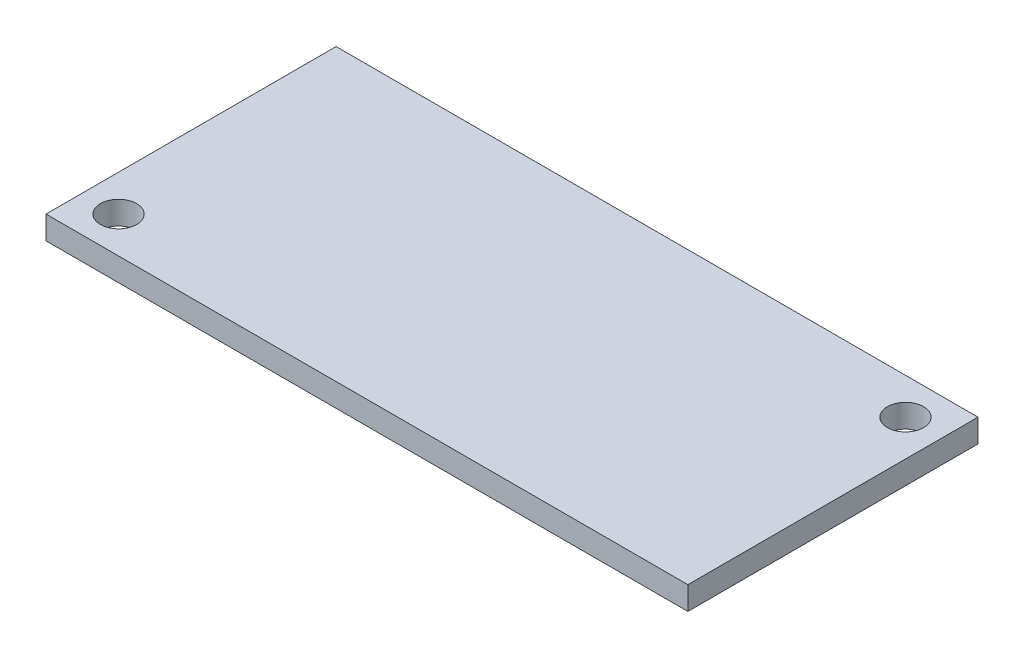
ISO-10303-21;
HEADER;
FILE_DESCRIPTION(('STEP AP214'),'2;1');
FILE_NAME('part.step','',(''),(''),'','','');
FILE_SCHEMA(('AUTOMOTIVE_DESIGN { 1 0 10303 214 1 1 1 1 }'));
ENDSEC;
DATA;
#1=APPLICATION_CONTEXT('core data for automotive mechanical design processes');
#2=APPLICATION_PROTOCOL_DEFINITION('international standard','automotive_design',2000,#1);
#3=PRODUCT_CONTEXT('',#1,'mechanical');
#4=PRODUCT('Part','Part','',(#3));
#5=PRODUCT_RELATED_PRODUCT_CATEGORY('part','',(#4));
#6=PRODUCT_DEFINITION_FORMATION('','',#4);
#7=PRODUCT_DEFINITION_CONTEXT('part definition',#1,'design');
#8=PRODUCT_DEFINITION('design','',#6,#7);
#9=PRODUCT_DEFINITION_SHAPE('','',#8);
#10=(LENGTH_UNIT() NAMED_UNIT(*) SI_UNIT(.MILLI.,.METRE.));
#11=(NAMED_UNIT(*) PLANE_ANGLE_UNIT() SI_UNIT($,.RADIAN.));
#12=(NAMED_UNIT(*) SI_UNIT($,.STERADIAN.) SOLID_ANGLE_UNIT());
#13=UNCERTAINTY_MEASURE_WITH_UNIT(LENGTH_MEASURE(1.E-05),#10,'distance_accuracy_value','');
#14=(GEOMETRIC_REPRESENTATION_CONTEXT(3) GLOBAL_UNCERTAINTY_ASSIGNED_CONTEXT((#13)) GLOBAL_UNIT_ASSIGNED_CONTEXT((#10,
#11,#12)) REPRESENTATION_CONTEXT('',''));
#15=CARTESIAN_POINT('',(0.,0.,0.));
#16=DIRECTION('',(0.,0.,1.));
#17=DIRECTION('',(1.,0.,0.));
#18=AXIS2_PLACEMENT_3D('',#15,#16,#17);
#19=CARTESIAN_POINT('',(22.125,1.6,10.));
#20=DIRECTION('',(-1.,0.,0.));
#21=DIRECTION('',(0.,0.,1.));
#22=AXIS2_PLACEMENT_3D('',#19,#20,#21);
#23=PLANE('',#22);
#24=DIRECTION('',(0.,0.,-1.));
#25=VECTOR('',#24,1.);
#26=CARTESIAN_POINT('',(22.125,0.,10.));
#27=LINE('',#26,#25);
#28=CARTESIAN_POINT('',(22.125,0.,10.));
#29=VERTEX_POINT('',#28);
#30=CARTESIAN_POINT('',(22.125,0.,-10.));
#31=VERTEX_POINT('',#30);
#32=EDGE_CURVE('E95',#29,#31,#27,.T.);
#33=ORIENTED_EDGE('',*,*,#32,.T.);
#34=DIRECTION('',(0.,-1.,0.));
#35=VECTOR('',#34,1.);
#36=CARTESIAN_POINT('',(22.125,1.6,-10.));
#37=LINE('',#36,#35);
#38=CARTESIAN_POINT('',(22.125,1.6,-10.));
#39=VERTEX_POINT('',#38);
#40=EDGE_CURVE('E11',#39,#31,#37,.T.);
#41=ORIENTED_EDGE('',*,*,#40,.F.);
#42=DIRECTION('',(0.,0.,-1.));
#43=VECTOR('',#42,1.);
#44=CARTESIAN_POINT('',(22.125,1.6,10.));
#45=LINE('',#44,#43);
#46=CARTESIAN_POINT('',(22.125,1.6,10.));
#47=VERTEX_POINT('',#46);
#48=EDGE_CURVE('E83',#47,#39,#45,.T.);
#49=ORIENTED_EDGE('',*,*,#48,.F.);
#50=DIRECTION('',(0.,-1.,0.));
#51=VECTOR('',#50,1.);
#52=CARTESIAN_POINT('',(22.125,1.6,10.));
#53=LINE('',#52,#51);
#54=EDGE_CURVE('E91',#47,#29,#53,.T.);
#55=ORIENTED_EDGE('',*,*,#54,.T.);
#56=EDGE_LOOP('',(#33,#41,#49,#55));
#57=FACE_BOUND('',#56,.T.);
#58=ADVANCED_FACE('F32',(#57),#23,.F.);
#59=CARTESIAN_POINT('',(-22.125,1.6,-10.));
#60=DIRECTION('',(0.,0.,1.));
#61=DIRECTION('',(1.,0.,0.));
#62=AXIS2_PLACEMENT_3D('',#59,#60,#61);
#63=PLANE('',#62);
#64=DIRECTION('',(-1.,0.,0.));
#65=VECTOR('',#64,1.);
#66=CARTESIAN_POINT('',(-22.125,0.,-10.));
#67=LINE('',#66,#65);
#68=CARTESIAN_POINT('',(-22.125,0.,-10.));
#69=VERTEX_POINT('',#68);
#70=EDGE_CURVE('E87',#31,#69,#67,.T.);
#71=ORIENTED_EDGE('',*,*,#70,.T.);
#72=DIRECTION('',(0.,-1.,0.));
#73=VECTOR('',#72,1.);
#74=CARTESIAN_POINT('',(-22.125,1.6,-10.));
#75=LINE('',#74,#73);
#76=CARTESIAN_POINT('',(-22.125,1.6,-10.));
#77=VERTEX_POINT('',#76);
#78=EDGE_CURVE('E40',#77,#69,#75,.T.);
#79=ORIENTED_EDGE('',*,*,#78,.F.);
#80=DIRECTION('',(-1.,0.,0.));
#81=VECTOR('',#80,1.);
#82=CARTESIAN_POINT('',(-22.125,1.6,-10.));
#83=LINE('',#82,#81);
#84=EDGE_CURVE('E78',#39,#77,#83,.T.);
#85=ORIENTED_EDGE('',*,*,#84,.F.);
#86=ORIENTED_EDGE('',*,*,#40,.T.);
#87=EDGE_LOOP('',(#71,#79,#85,#86));
#88=FACE_BOUND('',#87,.T.);
#89=ADVANCED_FACE('F86',(#88),#63,.F.);
#90=CARTESIAN_POINT('',(-22.125,1.6,10.));
#91=DIRECTION('',(1.,0.,0.));
#92=DIRECTION('',(0.,0.,-1.));
#93=AXIS2_PLACEMENT_3D('',#90,#91,#92);
#94=PLANE('',#93);
#95=DIRECTION('',(0.,0.,1.));
#96=VECTOR('',#95,1.);
#97=CARTESIAN_POINT('',(-22.125,0.,10.));
#98=LINE('',#97,#96);
#99=CARTESIAN_POINT('',(-22.125,0.,10.));
#100=VERTEX_POINT('',#99);
#101=EDGE_CURVE('E65',#69,#100,#98,.T.);
#102=ORIENTED_EDGE('',*,*,#101,.T.);
#103=DIRECTION('',(0.,-1.,0.));
#104=VECTOR('',#103,1.);
#105=CARTESIAN_POINT('',(-22.125,1.6,10.));
#106=LINE('',#105,#104);
#107=CARTESIAN_POINT('',(-22.125,1.6,10.));
#108=VERTEX_POINT('',#107);
#109=EDGE_CURVE('E88',#108,#100,#106,.T.);
#110=ORIENTED_EDGE('',*,*,#109,.F.);
#111=DIRECTION('',(0.,0.,1.));
#112=VECTOR('',#111,1.);
#113=CARTESIAN_POINT('',(-22.125,1.6,10.));
#114=LINE('',#113,#112);
#115=EDGE_CURVE('E81',#77,#108,#114,.T.);
#116=ORIENTED_EDGE('',*,*,#115,.F.);
#117=ORIENTED_EDGE('',*,*,#78,.T.);
#118=EDGE_LOOP('',(#102,#110,#116,#117));
#119=FACE_BOUND('',#118,.T.);
#120=ADVANCED_FACE('F89',(#119),#94,.F.);
#121=CARTESIAN_POINT('',(-22.125,1.6,10.));
#122=DIRECTION('',(0.,0.,-1.));
#123=DIRECTION('',(-1.,0.,0.));
#124=AXIS2_PLACEMENT_3D('',#121,#122,#123);
#125=PLANE('',#124);
#126=DIRECTION('',(1.,0.,0.));
#127=VECTOR('',#126,1.);
#128=CARTESIAN_POINT('',(-22.125,0.,10.));
#129=LINE('',#128,#127);
#130=EDGE_CURVE('E71',#100,#29,#129,.T.);
#131=ORIENTED_EDGE('',*,*,#130,.T.);
#132=ORIENTED_EDGE('',*,*,#54,.F.);
#133=DIRECTION('',(1.,0.,0.));
#134=VECTOR('',#133,1.);
#135=CARTESIAN_POINT('',(-22.125,1.6,10.));
#136=LINE('',#135,#134);
#137=EDGE_CURVE('E48',#108,#47,#136,.T.);
#138=ORIENTED_EDGE('',*,*,#137,.F.);
#139=ORIENTED_EDGE('',*,*,#109,.T.);
#140=EDGE_LOOP('',(#131,#132,#138,#139));
#141=FACE_BOUND('',#140,.T.);
#142=ADVANCED_FACE('F103',(#141),#125,.F.);
#143=CARTESIAN_POINT('',(0.,1.6,0.));
#144=DIRECTION('',(0.,-1.,0.));
#145=DIRECTION('',(0.,0.,-1.));
#146=AXIS2_PLACEMENT_3D('',#143,#144,#145);
#147=PLANE('',#146);
#148=CARTESIAN_POINT('',(19.625,1.6,-7.5));
#149=DIRECTION('',(0.,1.,0.));
#150=DIRECTION('',(0.,0.,1.));
#151=AXIS2_PLACEMENT_3D('',#148,#149,#150);
#152=CIRCLE('',#151,1.25);
#153=CARTESIAN_POINT('',(19.625,1.6,-6.25));
#154=VERTEX_POINT('',#153);
#155=EDGE_CURVE('E115',#154,#154,#152,.T.);
#156=ORIENTED_EDGE('',*,*,#155,.F.);
#157=EDGE_LOOP('',(#156));
#158=FACE_BOUND('',#157,.T.);
#159=CARTESIAN_POINT('',(-19.625,1.6,7.5));
#160=DIRECTION('',(0.,1.,0.));
#161=DIRECTION('',(0.,0.,1.));
#162=AXIS2_PLACEMENT_3D('',#159,#160,#161);
#163=CIRCLE('',#162,1.25);
#164=CARTESIAN_POINT('',(-19.625,1.6,8.75));
#165=VERTEX_POINT('',#164);
#166=EDGE_CURVE('E109',#165,#165,#163,.T.);
#167=ORIENTED_EDGE('',*,*,#166,.F.);
#168=EDGE_LOOP('',(#167));
#169=FACE_BOUND('',#168,.T.);
#170=ORIENTED_EDGE('',*,*,#48,.T.);
#171=ORIENTED_EDGE('',*,*,#84,.T.);
#172=ORIENTED_EDGE('',*,*,#115,.T.);
#173=ORIENTED_EDGE('',*,*,#137,.T.);
#174=EDGE_LOOP('',(#170,#171,#172,#173));
#175=FACE_BOUND('',#174,.T.);
#176=ADVANCED_FACE('F79',(#158,#169,#175),#147,.F.);
#177=CARTESIAN_POINT('',(0.,0.,0.));
#178=DIRECTION('',(0.,-1.,0.));
#179=DIRECTION('',(0.,0.,-1.));
#180=AXIS2_PLACEMENT_3D('',#177,#178,#179);
#181=PLANE('',#180);
#182=CARTESIAN_POINT('',(19.625,0.,-7.5));
#183=DIRECTION('',(0.,1.,0.));
#184=DIRECTION('',(0.,0.,1.));
#185=AXIS2_PLACEMENT_3D('',#182,#183,#184);
#186=CIRCLE('',#185,1.25);
#187=CARTESIAN_POINT('',(19.625,0.,-6.25));
#188=VERTEX_POINT('',#187);
#189=EDGE_CURVE('E112',#188,#188,#186,.T.);
#190=ORIENTED_EDGE('',*,*,#189,.T.);
#191=EDGE_LOOP('',(#190));
#192=FACE_BOUND('',#191,.T.);
#193=CARTESIAN_POINT('',(-19.625,0.,7.5));
#194=DIRECTION('',(0.,1.,0.));
#195=DIRECTION('',(0.,0.,1.));
#196=AXIS2_PLACEMENT_3D('',#193,#194,#195);
#197=CIRCLE('',#196,1.25);
#198=CARTESIAN_POINT('',(-19.625,0.,8.75));
#199=VERTEX_POINT('',#198);
#200=EDGE_CURVE('E98',#199,#199,#197,.T.);
#201=ORIENTED_EDGE('',*,*,#200,.T.);
#202=EDGE_LOOP('',(#201));
#203=FACE_BOUND('',#202,.T.);
#204=ORIENTED_EDGE('',*,*,#32,.F.);
#205=ORIENTED_EDGE('',*,*,#130,.F.);
#206=ORIENTED_EDGE('',*,*,#101,.F.);
#207=ORIENTED_EDGE('',*,*,#70,.F.);
#208=EDGE_LOOP('',(#204,#205,#206,#207));
#209=FACE_BOUND('',#208,.T.);
#210=ADVANCED_FACE('F106',(#192,#203,#209),#181,.T.);
#211=CARTESIAN_POINT('',(-19.625,0.,7.5));
#212=DIRECTION('',(0.,1.,0.));
#213=DIRECTION('',(0.,0.,1.));
#214=AXIS2_PLACEMENT_3D('',#211,#212,#213);
#215=CYLINDRICAL_SURFACE('',#214,1.25);
#216=ORIENTED_EDGE('',*,*,#200,.F.);
#217=EDGE_LOOP('',(#216));
#218=FACE_BOUND('',#217,.T.);
#219=ORIENTED_EDGE('',*,*,#166,.T.);
#220=EDGE_LOOP('',(#219));
#221=FACE_BOUND('',#220,.T.);
#222=ADVANCED_FACE('F126',(#218,#221),#215,.F.);
#223=CARTESIAN_POINT('',(19.625,0.,-7.5));
#224=DIRECTION('',(0.,1.,0.));
#225=DIRECTION('',(0.,0.,1.));
#226=AXIS2_PLACEMENT_3D('',#223,#224,#225);
#227=CYLINDRICAL_SURFACE('',#226,1.25);
#228=ORIENTED_EDGE('',*,*,#189,.F.);
#229=EDGE_LOOP('',(#228));
#230=FACE_BOUND('',#229,.T.);
#231=ORIENTED_EDGE('',*,*,#155,.T.);
#232=EDGE_LOOP('',(#231));
#233=FACE_BOUND('',#232,.T.);
#234=ADVANCED_FACE('F123',(#230,#233),#227,.F.);
#235=CLOSED_SHELL('',(#58,#89,#120,#142,#176,#210,#222,#234));
#236=MANIFOLD_SOLID_BREP('B2',#235);
#237=ADVANCED_BREP_SHAPE_REPRESENTATION('',(#18,#236),#14);
#238=SHAPE_DEFINITION_REPRESENTATION(#9,#237);
ENDSEC;
END-ISO-10303-21;
